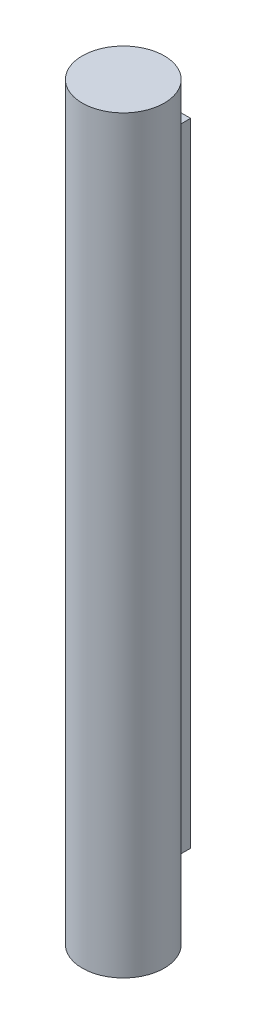
ISO-10303-21;
HEADER;
FILE_DESCRIPTION(('STEP AP214'),'2;1');
FILE_NAME('part.step','',(''),(''),'','','');
FILE_SCHEMA(('AUTOMOTIVE_DESIGN { 1 0 10303 214 1 1 1 1 }'));
ENDSEC;
DATA;
#1=APPLICATION_CONTEXT('core data for automotive mechanical design processes');
#2=APPLICATION_PROTOCOL_DEFINITION('international standard','automotive_design',2000,#1);
#3=PRODUCT_CONTEXT('',#1,'mechanical');
#4=PRODUCT('Part','Part','',(#3));
#5=PRODUCT_RELATED_PRODUCT_CATEGORY('part','',(#4));
#6=PRODUCT_DEFINITION_FORMATION('','',#4);
#7=PRODUCT_DEFINITION_CONTEXT('part definition',#1,'design');
#8=PRODUCT_DEFINITION('design','',#6,#7);
#9=PRODUCT_DEFINITION_SHAPE('','',#8);
#10=(LENGTH_UNIT() NAMED_UNIT(*) SI_UNIT(.MILLI.,.METRE.));
#11=(NAMED_UNIT(*) PLANE_ANGLE_UNIT() SI_UNIT($,.RADIAN.));
#12=(NAMED_UNIT(*) SI_UNIT($,.STERADIAN.) SOLID_ANGLE_UNIT());
#13=UNCERTAINTY_MEASURE_WITH_UNIT(LENGTH_MEASURE(1.E-05),#10,'distance_accuracy_value','');
#14=(GEOMETRIC_REPRESENTATION_CONTEXT(3) GLOBAL_UNCERTAINTY_ASSIGNED_CONTEXT((#13)) GLOBAL_UNIT_ASSIGNED_CONTEXT((#10,
#11,#12)) REPRESENTATION_CONTEXT('',''));
#15=CARTESIAN_POINT('',(0.,0.,0.));
#16=DIRECTION('',(0.,0.,1.));
#17=DIRECTION('',(1.,0.,0.));
#18=AXIS2_PLACEMENT_3D('',#15,#16,#17);
#19=CARTESIAN_POINT('',(0.,85.725,0.));
#20=DIRECTION('',(0.,-1.,0.));
#21=DIRECTION('',(0.,0.,-1.));
#22=AXIS2_PLACEMENT_3D('',#19,#20,#21);
#23=CYLINDRICAL_SURFACE('',#22,5.55625);
#24=CARTESIAN_POINT('',(0.,7.9375,0.));
#25=DIRECTION('',(0.,1.,0.));
#26=DIRECTION('',(0.,0.,1.));
#27=AXIS2_PLACEMENT_3D('',#24,#25,#26);
#28=CIRCLE('',#27,5.55625);
#29=CARTESIAN_POINT('',(1.190625,7.9375,-5.42718400018601));
#30=VERTEX_POINT('',#29);
#31=CARTESIAN_POINT('',(-1.190625,7.9375,-5.42718400018601));
#32=VERTEX_POINT('',#31);
#33=EDGE_CURVE('E89',#30,#32,#28,.T.);
#34=ORIENTED_EDGE('',*,*,#33,.F.);
#35=DIRECTION('',(0.,-1.,0.));
#36=VECTOR('',#35,1.);
#37=CARTESIAN_POINT('',(1.190625,93.6625,-5.42718400018601));
#38=LINE('',#37,#36);
#39=CARTESIAN_POINT('',(1.190625,93.6625,-5.42718400018601));
#40=VERTEX_POINT('',#39);
#41=EDGE_CURVE('E13',#40,#30,#38,.T.);
#42=ORIENTED_EDGE('',*,*,#41,.F.);
#43=CARTESIAN_POINT('',(0.,93.6625,0.));
#44=DIRECTION('',(0.,1.,0.));
#45=DIRECTION('',(0.,0.,1.));
#46=AXIS2_PLACEMENT_3D('',#43,#44,#45);
#47=CIRCLE('',#46,5.55625);
#48=CARTESIAN_POINT('',(-1.190625,93.6625,-5.42718400018601));
#49=VERTEX_POINT('',#48);
#50=EDGE_CURVE('E91',#40,#49,#47,.T.);
#51=ORIENTED_EDGE('',*,*,#50,.T.);
#52=DIRECTION('',(0.,-1.,0.));
#53=VECTOR('',#52,1.);
#54=CARTESIAN_POINT('',(-1.190625,93.6625,-5.42718400018601));
#55=LINE('',#54,#53);
#56=EDGE_CURVE('E48',#49,#32,#55,.T.);
#57=ORIENTED_EDGE('',*,*,#56,.T.);
#58=EDGE_LOOP('',(#34,#42,#51,#57));
#59=FACE_BOUND('',#58,.T.);
#60=ADVANCED_FACE('F44',(#59),#23,.F.);
#61=CARTESIAN_POINT('',(1.190625,93.6625,0.));
#62=DIRECTION('',(1.,0.,0.));
#63=DIRECTION('',(0.,0.,-1.));
#64=AXIS2_PLACEMENT_3D('',#61,#62,#63);
#65=PLANE('',#64);
#66=DIRECTION('',(0.,0.,1.));
#67=VECTOR('',#66,1.);
#68=CARTESIAN_POINT('',(1.190625,7.9375,0.));
#69=LINE('',#68,#67);
#70=CARTESIAN_POINT('',(1.190625,7.9375,-7.9375));
#71=VERTEX_POINT('',#70);
#72=EDGE_CURVE('E101',#71,#30,#69,.T.);
#73=ORIENTED_EDGE('',*,*,#72,.F.);
#74=DIRECTION('',(0.,-1.,0.));
#75=VECTOR('',#74,1.);
#76=CARTESIAN_POINT('',(1.190625,93.6625,-7.9375));
#77=LINE('',#76,#75);
#78=CARTESIAN_POINT('',(1.190625,93.6625,-7.9375));
#79=VERTEX_POINT('',#78);
#80=EDGE_CURVE('E54',#79,#71,#77,.T.);
#81=ORIENTED_EDGE('',*,*,#80,.F.);
#82=DIRECTION('',(0.,0.,1.));
#83=VECTOR('',#82,1.);
#84=CARTESIAN_POINT('',(1.190625,93.6625,0.));
#85=LINE('',#84,#83);
#86=EDGE_CURVE('E105',#79,#40,#85,.T.);
#87=ORIENTED_EDGE('',*,*,#86,.T.);
#88=ORIENTED_EDGE('',*,*,#41,.T.);
#89=EDGE_LOOP('',(#73,#81,#87,#88));
#90=FACE_BOUND('',#89,.T.);
#91=ADVANCED_FACE('F46',(#90),#65,.T.);
#92=CARTESIAN_POINT('',(0.,93.6625,-7.9375));
#93=DIRECTION('',(0.,0.,-1.));
#94=DIRECTION('',(-1.,0.,0.));
#95=AXIS2_PLACEMENT_3D('',#92,#93,#94);
#96=PLANE('',#95);
#97=DIRECTION('',(1.,0.,0.));
#98=VECTOR('',#97,1.);
#99=CARTESIAN_POINT('',(0.,7.9375,-7.9375));
#100=LINE('',#99,#98);
#101=CARTESIAN_POINT('',(-1.190625,7.9375,-7.9375));
#102=VERTEX_POINT('',#101);
#103=EDGE_CURVE('E97',#102,#71,#100,.T.);
#104=ORIENTED_EDGE('',*,*,#103,.F.);
#105=DIRECTION('',(0.,-1.,0.));
#106=VECTOR('',#105,1.);
#107=CARTESIAN_POINT('',(-1.190625,93.6625,-7.9375));
#108=LINE('',#107,#106);
#109=CARTESIAN_POINT('',(-1.190625,93.6625,-7.9375));
#110=VERTEX_POINT('',#109);
#111=EDGE_CURVE('E82',#110,#102,#108,.T.);
#112=ORIENTED_EDGE('',*,*,#111,.F.);
#113=DIRECTION('',(1.,0.,0.));
#114=VECTOR('',#113,1.);
#115=CARTESIAN_POINT('',(0.,93.6625,-7.9375));
#116=LINE('',#115,#114);
#117=EDGE_CURVE('E108',#110,#79,#116,.T.);
#118=ORIENTED_EDGE('',*,*,#117,.T.);
#119=ORIENTED_EDGE('',*,*,#80,.T.);
#120=EDGE_LOOP('',(#104,#112,#118,#119));
#121=FACE_BOUND('',#120,.T.);
#122=ADVANCED_FACE('F116',(#121),#96,.T.);
#123=CARTESIAN_POINT('',(-1.190625,93.6625,0.));
#124=DIRECTION('',(1.,0.,0.));
#125=DIRECTION('',(0.,0.,-1.));
#126=AXIS2_PLACEMENT_3D('',#123,#124,#125);
#127=PLANE('',#126);
#128=DIRECTION('',(0.,0.,1.));
#129=VECTOR('',#128,1.);
#130=CARTESIAN_POINT('',(-1.190625,7.9375,0.));
#131=LINE('',#130,#129);
#132=EDGE_CURVE('E92',#102,#32,#131,.T.);
#133=ORIENTED_EDGE('',*,*,#132,.T.);
#134=ORIENTED_EDGE('',*,*,#56,.F.);
#135=DIRECTION('',(0.,0.,1.));
#136=VECTOR('',#135,1.);
#137=CARTESIAN_POINT('',(-1.190625,93.6625,0.));
#138=LINE('',#137,#136);
#139=EDGE_CURVE('E62',#110,#49,#138,.T.);
#140=ORIENTED_EDGE('',*,*,#139,.F.);
#141=ORIENTED_EDGE('',*,*,#111,.T.);
#142=EDGE_LOOP('',(#133,#134,#140,#141));
#143=FACE_BOUND('',#142,.T.);
#144=ADVANCED_FACE('F93',(#143),#127,.F.);
#145=CARTESIAN_POINT('',(0.,93.6625,0.));
#146=DIRECTION('',(0.,1.,0.));
#147=DIRECTION('',(0.,0.,1.));
#148=AXIS2_PLACEMENT_3D('',#145,#146,#147);
#149=PLANE('',#148);
#150=ORIENTED_EDGE('',*,*,#50,.F.);
#151=ORIENTED_EDGE('',*,*,#86,.F.);
#152=ORIENTED_EDGE('',*,*,#117,.F.);
#153=ORIENTED_EDGE('',*,*,#139,.T.);
#154=EDGE_LOOP('',(#150,#151,#152,#153));
#155=FACE_BOUND('',#154,.T.);
#156=ADVANCED_FACE('F118',(#155),#149,.T.);
#157=CARTESIAN_POINT('',(0.,7.9375,0.));
#158=DIRECTION('',(0.,1.,0.));
#159=DIRECTION('',(0.,0.,1.));
#160=AXIS2_PLACEMENT_3D('',#157,#158,#159);
#161=PLANE('',#160);
#162=ORIENTED_EDGE('',*,*,#33,.T.);
#163=ORIENTED_EDGE('',*,*,#132,.F.);
#164=ORIENTED_EDGE('',*,*,#103,.T.);
#165=ORIENTED_EDGE('',*,*,#72,.T.);
#166=EDGE_LOOP('',(#162,#163,#164,#165));
#167=FACE_BOUND('',#166,.T.);
#168=ADVANCED_FACE('F99',(#167),#161,.F.);
#169=CLOSED_SHELL('',(#60,#91,#122,#144,#156,#168));
#170=MANIFOLD_SOLID_BREP('B2',#169);
#171=CARTESIAN_POINT('',(0.,101.6,0.));
#172=DIRECTION('',(0.,-1.,0.));
#173=DIRECTION('',(0.,0.,-1.));
#174=AXIS2_PLACEMENT_3D('',#171,#172,#173);
#175=CYLINDRICAL_SURFACE('',#174,5.55625);
#176=CARTESIAN_POINT('',(0.,101.6,0.));
#177=DIRECTION('',(0.,1.,0.));
#178=DIRECTION('',(0.,0.,1.));
#179=AXIS2_PLACEMENT_3D('',#176,#177,#178);
#180=CIRCLE('',#179,5.55625);
#181=CARTESIAN_POINT('',(0.,101.6,5.55625));
#182=VERTEX_POINT('',#181);
#183=EDGE_CURVE('E43',#182,#182,#180,.T.);
#184=ORIENTED_EDGE('',*,*,#183,.F.);
#185=EDGE_LOOP('',(#184));
#186=FACE_BOUND('',#185,.T.);
#187=CARTESIAN_POINT('',(0.,0.,0.));
#188=DIRECTION('',(0.,1.,0.));
#189=DIRECTION('',(0.,0.,1.));
#190=AXIS2_PLACEMENT_3D('',#187,#188,#189);
#191=CIRCLE('',#190,5.55625);
#192=CARTESIAN_POINT('',(0.,0.,5.55625));
#193=VERTEX_POINT('',#192);
#194=EDGE_CURVE('E171',#193,#193,#191,.T.);
#195=ORIENTED_EDGE('',*,*,#194,.T.);
#196=EDGE_LOOP('',(#195));
#197=FACE_BOUND('',#196,.T.);
#198=ADVANCED_FACE('F168',(#186,#197),#175,.T.);
#199=CARTESIAN_POINT('',(0.,101.6,0.));
#200=DIRECTION('',(0.,1.,0.));
#201=DIRECTION('',(0.,0.,1.));
#202=AXIS2_PLACEMENT_3D('',#199,#200,#201);
#203=PLANE('',#202);
#204=ORIENTED_EDGE('',*,*,#183,.T.);
#205=EDGE_LOOP('',(#204));
#206=FACE_BOUND('',#205,.T.);
#207=ADVANCED_FACE('F183',(#206),#203,.T.);
#208=CARTESIAN_POINT('',(0.,0.,0.));
#209=DIRECTION('',(0.,1.,0.));
#210=DIRECTION('',(0.,0.,1.));
#211=AXIS2_PLACEMENT_3D('',#208,#209,#210);
#212=PLANE('',#211);
#213=ORIENTED_EDGE('',*,*,#194,.F.);
#214=EDGE_LOOP('',(#213));
#215=FACE_BOUND('',#214,.T.);
#216=ADVANCED_FACE('F181',(#215),#212,.F.);
#217=CLOSED_SHELL('',(#198,#207,#216));
#218=MANIFOLD_SOLID_BREP('B7',#217);
#219=ADVANCED_BREP_SHAPE_REPRESENTATION('',(#18,#170,#218),#14);
#220=SHAPE_DEFINITION_REPRESENTATION(#9,#219);
ENDSEC;
END-ISO-10303-21;
